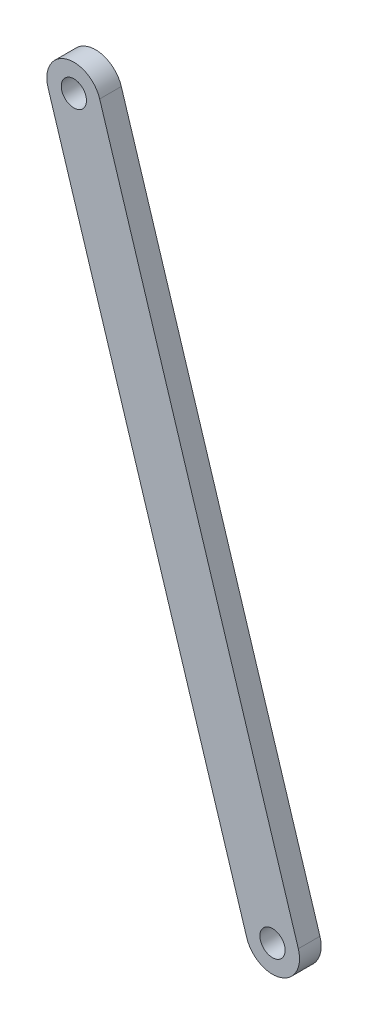
ISO-10303-21;
HEADER;
FILE_DESCRIPTION(('STEP AP214'),'2;1');
FILE_NAME('part.step','',(''),(''),'','','');
FILE_SCHEMA(('AUTOMOTIVE_DESIGN { 1 0 10303 214 1 1 1 1 }'));
ENDSEC;
DATA;
#1=APPLICATION_CONTEXT('core data for automotive mechanical design processes');
#2=APPLICATION_PROTOCOL_DEFINITION('international standard','automotive_design',2000,#1);
#3=PRODUCT_CONTEXT('',#1,'mechanical');
#4=PRODUCT('Part','Part','',(#3));
#5=PRODUCT_RELATED_PRODUCT_CATEGORY('part','',(#4));
#6=PRODUCT_DEFINITION_FORMATION('','',#4);
#7=PRODUCT_DEFINITION_CONTEXT('part definition',#1,'design');
#8=PRODUCT_DEFINITION('design','',#6,#7);
#9=PRODUCT_DEFINITION_SHAPE('','',#8);
#10=(LENGTH_UNIT() NAMED_UNIT(*) SI_UNIT(.MILLI.,.METRE.));
#11=(NAMED_UNIT(*) PLANE_ANGLE_UNIT() SI_UNIT($,.RADIAN.));
#12=(NAMED_UNIT(*) SI_UNIT($,.STERADIAN.) SOLID_ANGLE_UNIT());
#13=UNCERTAINTY_MEASURE_WITH_UNIT(LENGTH_MEASURE(1.E-05),#10,'distance_accuracy_value','');
#14=(GEOMETRIC_REPRESENTATION_CONTEXT(3) GLOBAL_UNCERTAINTY_ASSIGNED_CONTEXT((#13)) GLOBAL_UNIT_ASSIGNED_CONTEXT((#10,
#11,#12)) REPRESENTATION_CONTEXT('',''));
#15=CARTESIAN_POINT('',(0.,0.,0.));
#16=DIRECTION('',(0.,0.,1.));
#17=DIRECTION('',(1.,0.,0.));
#18=AXIS2_PLACEMENT_3D('',#15,#16,#17);
#19=CARTESIAN_POINT('',(-55.1073685738543,-64.716133451137,6.));
#20=DIRECTION('',(0.,0.,1.));
#21=DIRECTION('',(1.,0.,0.));
#22=AXIS2_PLACEMENT_3D('',#19,#20,#21);
#23=PLANE('',#22);
#24=CARTESIAN_POINT('',(0.,-241.317882957945,6.));
#25=DIRECTION('',(0.,0.,1.));
#26=DIRECTION('',(1.,0.,0.));
#27=AXIS2_PLACEMENT_3D('',#24,#25,#26);
#28=CIRCLE('',#27,3.50000000000001);
#29=CARTESIAN_POINT('',(3.49999999999999,-241.317882957945,6.));
#30=VERTEX_POINT('',#29);
#31=EDGE_CURVE('E100',#30,#30,#28,.T.);
#32=ORIENTED_EDGE('',*,*,#31,.F.);
#33=EDGE_LOOP('',(#32));
#34=FACE_BOUND('',#33,.T.);
#35=CARTESIAN_POINT('',(-55.1073685738543,-64.716133451137,6.));
#36=DIRECTION('',(0.,0.,1.));
#37=DIRECTION('',(1.,0.,0.));
#38=AXIS2_PLACEMENT_3D('',#35,#36,#37);
#39=CIRCLE('',#38,7.49999999999998);
#40=CARTESIAN_POINT('',(-47.9478381884432,-62.4820509413861,6.));
#41=VERTEX_POINT('',#40);
#42=CARTESIAN_POINT('',(-62.2668989592654,-66.9502159608878,6.));
#43=VERTEX_POINT('',#42);
#44=EDGE_CURVE('E85',#41,#43,#39,.T.);
#45=ORIENTED_EDGE('',*,*,#44,.T.);
#46=DIRECTION('',(0.29787766796678,-0.954604051388152,0.));
#47=VECTOR('',#46,1.);
#48=CARTESIAN_POINT('',(-62.2668989592654,-66.9502159608878,6.));
#49=LINE('',#48,#47);
#50=CARTESIAN_POINT('',(-7.15953038541116,-243.551965467696,6.));
#51=VERTEX_POINT('',#50);
#52=EDGE_CURVE('E80',#43,#51,#49,.T.);
#53=ORIENTED_EDGE('',*,*,#52,.T.);
#54=CARTESIAN_POINT('',(0.,-241.317882957945,6.));
#55=DIRECTION('',(0.,0.,1.));
#56=DIRECTION('',(1.,0.,0.));
#57=AXIS2_PLACEMENT_3D('',#54,#55,#56);
#58=CIRCLE('',#57,7.5);
#59=CARTESIAN_POINT('',(7.15953038541112,-239.083800448194,6.));
#60=VERTEX_POINT('',#59);
#61=EDGE_CURVE('E83',#51,#60,#58,.T.);
#62=ORIENTED_EDGE('',*,*,#61,.T.);
#63=DIRECTION('',(-0.29787766796678,0.954604051388152,0.));
#64=VECTOR('',#63,1.);
#65=CARTESIAN_POINT('',(7.15953038541112,-239.083800448194,6.));
#66=LINE('',#65,#64);
#67=EDGE_CURVE('E50',#60,#41,#66,.T.);
#68=ORIENTED_EDGE('',*,*,#67,.T.);
#69=EDGE_LOOP('',(#45,#53,#62,#68));
#70=FACE_BOUND('',#69,.T.);
#71=CARTESIAN_POINT('',(-55.1073685738543,-64.716133451137,6.));
#72=DIRECTION('',(0.,0.,1.));
#73=DIRECTION('',(1.,0.,0.));
#74=AXIS2_PLACEMENT_3D('',#71,#72,#73);
#75=CIRCLE('',#74,3.50000000000001);
#76=CARTESIAN_POINT('',(-51.6073685738543,-64.716133451137,6.));
#77=VERTEX_POINT('',#76);
#78=EDGE_CURVE('E115',#77,#77,#75,.T.);
#79=ORIENTED_EDGE('',*,*,#78,.F.);
#80=EDGE_LOOP('',(#79));
#81=FACE_BOUND('',#80,.T.);
#82=ADVANCED_FACE('F33',(#34,#70,#81),#23,.T.);
#83=CARTESIAN_POINT('',(-55.1073685738543,-64.716133451137,0.));
#84=DIRECTION('',(0.,0.,1.));
#85=DIRECTION('',(1.,0.,0.));
#86=AXIS2_PLACEMENT_3D('',#83,#84,#85);
#87=PLANE('',#86);
#88=CARTESIAN_POINT('',(-55.1073685738543,-64.716133451137,0.));
#89=DIRECTION('',(0.,0.,1.));
#90=DIRECTION('',(1.,0.,0.));
#91=AXIS2_PLACEMENT_3D('',#88,#89,#90);
#92=CIRCLE('',#91,7.49999999999998);
#93=CARTESIAN_POINT('',(-47.9478381884432,-62.4820509413861,0.));
#94=VERTEX_POINT('',#93);
#95=CARTESIAN_POINT('',(-62.2668989592654,-66.9502159608878,0.));
#96=VERTEX_POINT('',#95);
#97=EDGE_CURVE('E97',#94,#96,#92,.T.);
#98=ORIENTED_EDGE('',*,*,#97,.F.);
#99=DIRECTION('',(-0.29787766796678,0.954604051388152,0.));
#100=VECTOR('',#99,1.);
#101=CARTESIAN_POINT('',(7.15953038541112,-239.083800448194,0.));
#102=LINE('',#101,#100);
#103=CARTESIAN_POINT('',(7.15953038541112,-239.083800448194,0.));
#104=VERTEX_POINT('',#103);
#105=EDGE_CURVE('E73',#104,#94,#102,.T.);
#106=ORIENTED_EDGE('',*,*,#105,.F.);
#107=CARTESIAN_POINT('',(0.,-241.317882957945,0.));
#108=DIRECTION('',(0.,0.,1.));
#109=DIRECTION('',(1.,0.,0.));
#110=AXIS2_PLACEMENT_3D('',#107,#108,#109);
#111=CIRCLE('',#110,7.5);
#112=CARTESIAN_POINT('',(-7.15953038541116,-243.551965467696,0.));
#113=VERTEX_POINT('',#112);
#114=EDGE_CURVE('E67',#113,#104,#111,.T.);
#115=ORIENTED_EDGE('',*,*,#114,.F.);
#116=DIRECTION('',(0.29787766796678,-0.954604051388152,0.));
#117=VECTOR('',#116,1.);
#118=CARTESIAN_POINT('',(-62.2668989592654,-66.9502159608878,0.));
#119=LINE('',#118,#117);
#120=EDGE_CURVE('E89',#96,#113,#119,.T.);
#121=ORIENTED_EDGE('',*,*,#120,.F.);
#122=EDGE_LOOP('',(#98,#106,#115,#121));
#123=FACE_BOUND('',#122,.T.);
#124=CARTESIAN_POINT('',(0.,-241.317882957945,0.));
#125=DIRECTION('',(0.,0.,1.));
#126=DIRECTION('',(1.,0.,0.));
#127=AXIS2_PLACEMENT_3D('',#124,#125,#126);
#128=CIRCLE('',#127,3.50000000000001);
#129=CARTESIAN_POINT('',(3.49999999999999,-241.317882957945,0.));
#130=VERTEX_POINT('',#129);
#131=EDGE_CURVE('E112',#130,#130,#128,.T.);
#132=ORIENTED_EDGE('',*,*,#131,.T.);
#133=EDGE_LOOP('',(#132));
#134=FACE_BOUND('',#133,.T.);
#135=CARTESIAN_POINT('',(-55.1073685738543,-64.716133451137,0.));
#136=DIRECTION('',(0.,0.,1.));
#137=DIRECTION('',(1.,0.,0.));
#138=AXIS2_PLACEMENT_3D('',#135,#136,#137);
#139=CIRCLE('',#138,3.50000000000001);
#140=CARTESIAN_POINT('',(-51.6073685738543,-64.716133451137,0.));
#141=VERTEX_POINT('',#140);
#142=EDGE_CURVE('E118',#141,#141,#139,.T.);
#143=ORIENTED_EDGE('',*,*,#142,.T.);
#144=EDGE_LOOP('',(#143));
#145=FACE_BOUND('',#144,.T.);
#146=ADVANCED_FACE('F108',(#123,#134,#145),#87,.F.);
#147=CARTESIAN_POINT('',(-55.1073685738543,-64.716133451137,6.));
#148=DIRECTION('',(0.,0.,-1.));
#149=DIRECTION('',(-1.,0.,0.));
#150=AXIS2_PLACEMENT_3D('',#147,#148,#149);
#151=CYLINDRICAL_SURFACE('',#150,7.49999999999998);
#152=ORIENTED_EDGE('',*,*,#97,.T.);
#153=DIRECTION('',(0.,0.,-1.));
#154=VECTOR('',#153,1.);
#155=CARTESIAN_POINT('',(-62.2668989592654,-66.9502159608878,6.));
#156=LINE('',#155,#154);
#157=EDGE_CURVE('E11',#43,#96,#156,.T.);
#158=ORIENTED_EDGE('',*,*,#157,.F.);
#159=ORIENTED_EDGE('',*,*,#44,.F.);
#160=DIRECTION('',(0.,0.,-1.));
#161=VECTOR('',#160,1.);
#162=CARTESIAN_POINT('',(-47.9478381884432,-62.4820509413861,6.));
#163=LINE('',#162,#161);
#164=EDGE_CURVE('E93',#41,#94,#163,.T.);
#165=ORIENTED_EDGE('',*,*,#164,.T.);
#166=EDGE_LOOP('',(#152,#158,#159,#165));
#167=FACE_BOUND('',#166,.T.);
#168=ADVANCED_FACE('F35',(#167),#151,.T.);
#169=CARTESIAN_POINT('',(-62.2668989592654,-66.9502159608878,6.));
#170=DIRECTION('',(0.954604051388152,0.29787766796678,0.));
#171=DIRECTION('',(-0.29787766796678,0.954604051388152,0.));
#172=AXIS2_PLACEMENT_3D('',#169,#170,#171);
#173=PLANE('',#172);
#174=ORIENTED_EDGE('',*,*,#120,.T.);
#175=DIRECTION('',(0.,0.,-1.));
#176=VECTOR('',#175,1.);
#177=CARTESIAN_POINT('',(-7.15953038541116,-243.551965467696,6.));
#178=LINE('',#177,#176);
#179=EDGE_CURVE('E42',#51,#113,#178,.T.);
#180=ORIENTED_EDGE('',*,*,#179,.F.);
#181=ORIENTED_EDGE('',*,*,#52,.F.);
#182=ORIENTED_EDGE('',*,*,#157,.T.);
#183=EDGE_LOOP('',(#174,#180,#181,#182));
#184=FACE_BOUND('',#183,.T.);
#185=ADVANCED_FACE('F88',(#184),#173,.F.);
#186=CARTESIAN_POINT('',(0.,-241.317882957945,6.));
#187=DIRECTION('',(0.,0.,-1.));
#188=DIRECTION('',(-1.,0.,0.));
#189=AXIS2_PLACEMENT_3D('',#186,#187,#188);
#190=CYLINDRICAL_SURFACE('',#189,7.5);
#191=ORIENTED_EDGE('',*,*,#114,.T.);
#192=DIRECTION('',(0.,0.,-1.));
#193=VECTOR('',#192,1.);
#194=CARTESIAN_POINT('',(7.15953038541112,-239.083800448194,6.));
#195=LINE('',#194,#193);
#196=EDGE_CURVE('E90',#60,#104,#195,.T.);
#197=ORIENTED_EDGE('',*,*,#196,.F.);
#198=ORIENTED_EDGE('',*,*,#61,.F.);
#199=ORIENTED_EDGE('',*,*,#179,.T.);
#200=EDGE_LOOP('',(#191,#197,#198,#199));
#201=FACE_BOUND('',#200,.T.);
#202=ADVANCED_FACE('F91',(#201),#190,.T.);
#203=CARTESIAN_POINT('',(7.15953038541112,-239.083800448194,6.));
#204=DIRECTION('',(-0.954604051388152,-0.29787766796678,0.));
#205=DIRECTION('',(0.29787766796678,-0.954604051388152,0.));
#206=AXIS2_PLACEMENT_3D('',#203,#204,#205);
#207=PLANE('',#206);
#208=ORIENTED_EDGE('',*,*,#105,.T.);
#209=ORIENTED_EDGE('',*,*,#164,.F.);
#210=ORIENTED_EDGE('',*,*,#67,.F.);
#211=ORIENTED_EDGE('',*,*,#196,.T.);
#212=EDGE_LOOP('',(#208,#209,#210,#211));
#213=FACE_BOUND('',#212,.T.);
#214=ADVANCED_FACE('F105',(#213),#207,.F.);
#215=CARTESIAN_POINT('',(0.,-241.317882957945,6.));
#216=DIRECTION('',(0.,0.,-1.));
#217=DIRECTION('',(-1.,0.,0.));
#218=AXIS2_PLACEMENT_3D('',#215,#216,#217);
#219=CYLINDRICAL_SURFACE('',#218,3.50000000000001);
#220=ORIENTED_EDGE('',*,*,#31,.T.);
#221=EDGE_LOOP('',(#220));
#222=FACE_BOUND('',#221,.T.);
#223=ORIENTED_EDGE('',*,*,#131,.F.);
#224=EDGE_LOOP('',(#223));
#225=FACE_BOUND('',#224,.T.);
#226=ADVANCED_FACE('F135',(#222,#225),#219,.F.);
#227=CARTESIAN_POINT('',(-55.1073685738543,-64.716133451137,6.));
#228=DIRECTION('',(0.,0.,-1.));
#229=DIRECTION('',(-1.,0.,0.));
#230=AXIS2_PLACEMENT_3D('',#227,#228,#229);
#231=CYLINDRICAL_SURFACE('',#230,3.50000000000001);
#232=ORIENTED_EDGE('',*,*,#78,.T.);
#233=EDGE_LOOP('',(#232));
#234=FACE_BOUND('',#233,.T.);
#235=ORIENTED_EDGE('',*,*,#142,.F.);
#236=EDGE_LOOP('',(#235));
#237=FACE_BOUND('',#236,.T.);
#238=ADVANCED_FACE('F124',(#234,#237),#231,.F.);
#239=CLOSED_SHELL('',(#82,#146,#168,#185,#202,#214,#226,#238));
#240=MANIFOLD_SOLID_BREP('B2',#239);
#241=ADVANCED_BREP_SHAPE_REPRESENTATION('',(#18,#240),#14);
#242=SHAPE_DEFINITION_REPRESENTATION(#9,#241);
ENDSEC;
END-ISO-10303-21;
